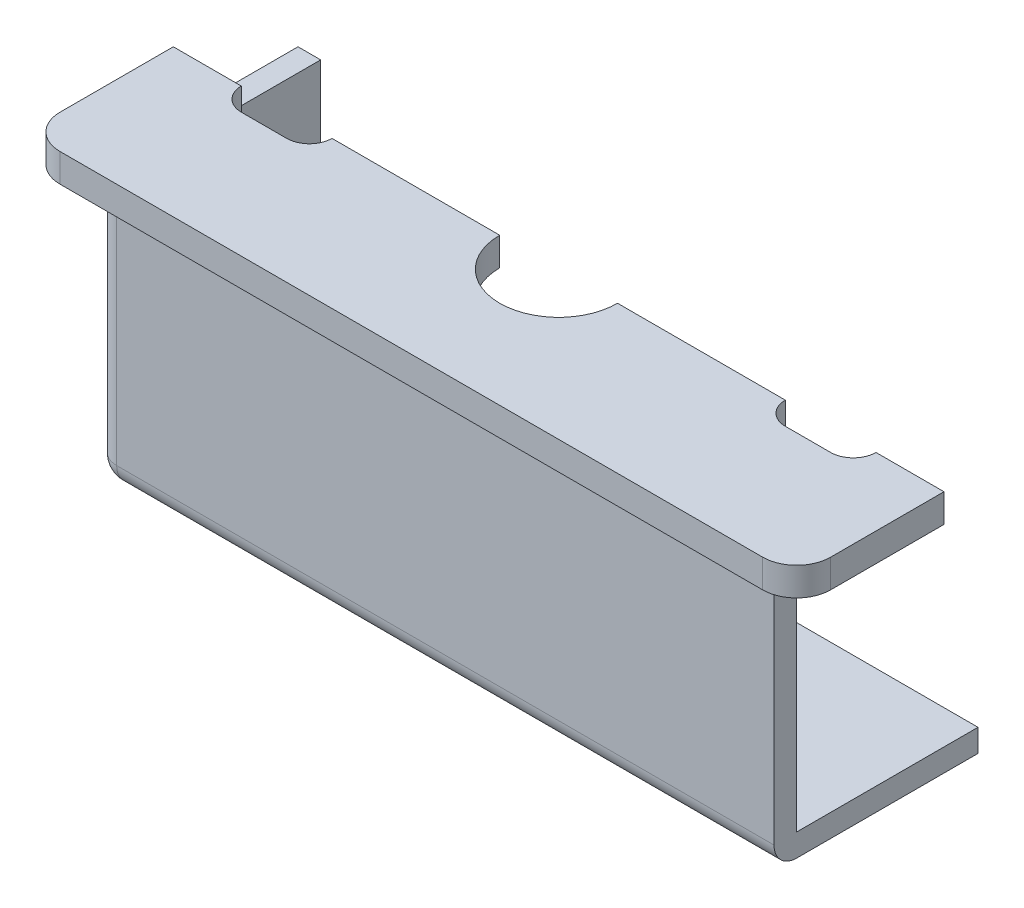
ISO-10303-21;
HEADER;
FILE_DESCRIPTION(('STEP AP214'),'2;1');
FILE_NAME('part.step','',(''),(''),'','','');
FILE_SCHEMA(('AUTOMOTIVE_DESIGN { 1 0 10303 214 1 1 1 1 }'));
ENDSEC;
DATA;
#1=APPLICATION_CONTEXT('core data for automotive mechanical design processes');
#2=APPLICATION_PROTOCOL_DEFINITION('international standard','automotive_design',2000,#1);
#3=PRODUCT_CONTEXT('',#1,'mechanical');
#4=PRODUCT('Part','Part','',(#3));
#5=PRODUCT_RELATED_PRODUCT_CATEGORY('part','',(#4));
#6=PRODUCT_DEFINITION_FORMATION('','',#4);
#7=PRODUCT_DEFINITION_CONTEXT('part definition',#1,'design');
#8=PRODUCT_DEFINITION('design','',#6,#7);
#9=PRODUCT_DEFINITION_SHAPE('','',#8);
#10=(LENGTH_UNIT() NAMED_UNIT(*) SI_UNIT(.MILLI.,.METRE.));
#11=(NAMED_UNIT(*) PLANE_ANGLE_UNIT() SI_UNIT($,.RADIAN.));
#12=(NAMED_UNIT(*) SI_UNIT($,.STERADIAN.) SOLID_ANGLE_UNIT());
#13=UNCERTAINTY_MEASURE_WITH_UNIT(LENGTH_MEASURE(1.E-05),#10,'distance_accuracy_value','');
#14=(GEOMETRIC_REPRESENTATION_CONTEXT(3) GLOBAL_UNCERTAINTY_ASSIGNED_CONTEXT((#13)) GLOBAL_UNIT_ASSIGNED_CONTEXT((#10,
#11,#12)) REPRESENTATION_CONTEXT('',''));
#15=CARTESIAN_POINT('',(0.,0.,0.));
#16=DIRECTION('',(0.,0.,1.));
#17=DIRECTION('',(1.,0.,0.));
#18=AXIS2_PLACEMENT_3D('',#15,#16,#17);
#19=CARTESIAN_POINT('',(14.5,-12.,-3.99999999999999));
#20=DIRECTION('',(1.,0.,0.));
#21=DIRECTION('',(0.,0.,-1.));
#22=AXIS2_PLACEMENT_3D('',#19,#20,#21);
#23=PLANE('',#22);
#24=DIRECTION('',(0.,1.,0.));
#25=VECTOR('',#24,1.);
#26=CARTESIAN_POINT('',(14.5,-12.,5.));
#27=LINE('',#26,#25);
#28=CARTESIAN_POINT('',(14.5,-11.,5.));
#29=VERTEX_POINT('',#28);
#30=CARTESIAN_POINT('',(14.5,0.,5.));
#31=VERTEX_POINT('',#30);
#32=EDGE_CURVE('E286',#29,#31,#27,.T.);
#33=ORIENTED_EDGE('',*,*,#32,.F.);
#34=CARTESIAN_POINT('',(14.5,-11.,4.));
#35=DIRECTION('',(1.,0.,0.));
#36=DIRECTION('',(0.,0.,-1.));
#37=AXIS2_PLACEMENT_3D('',#34,#35,#36);
#38=CIRCLE('',#37,1.);
#39=CARTESIAN_POINT('',(14.5,-12.,4.00000000000001));
#40=VERTEX_POINT('',#39);
#41=EDGE_CURVE('E302',#29,#40,#38,.T.);
#42=ORIENTED_EDGE('',*,*,#41,.T.);
#43=DIRECTION('',(0.,0.,-1.));
#44=VECTOR('',#43,1.);
#45=CARTESIAN_POINT('',(14.5,-12.,-3.99999999999999));
#46=LINE('',#45,#44);
#47=CARTESIAN_POINT('',(14.5,-12.,-3.99999999999999));
#48=VERTEX_POINT('',#47);
#49=EDGE_CURVE('E270',#40,#48,#46,.T.);
#50=ORIENTED_EDGE('',*,*,#49,.T.);
#51=DIRECTION('',(0.,1.,0.));
#52=VECTOR('',#51,1.);
#53=CARTESIAN_POINT('',(14.5,-12.,-3.99999999999999));
#54=LINE('',#53,#52);
#55=CARTESIAN_POINT('',(14.5,-11.,-3.99999999999999));
#56=VERTEX_POINT('',#55);
#57=EDGE_CURVE('E275',#48,#56,#54,.T.);
#58=ORIENTED_EDGE('',*,*,#57,.T.);
#59=DIRECTION('',(0.,0.,1.));
#60=VECTOR('',#59,1.);
#61=CARTESIAN_POINT('',(14.5,-11.,-3.99999999999999));
#62=LINE('',#61,#60);
#63=CARTESIAN_POINT('',(14.5,-11.,4.00000000000001));
#64=VERTEX_POINT('',#63);
#65=EDGE_CURVE('E253',#56,#64,#62,.T.);
#66=ORIENTED_EDGE('',*,*,#65,.T.);
#67=DIRECTION('',(0.,1.,0.));
#68=VECTOR('',#67,1.);
#69=CARTESIAN_POINT('',(14.5,-42.0832179129826,4.00000000000001));
#70=LINE('',#69,#68);
#71=CARTESIAN_POINT('',(14.5,0.,4.00000000000001));
#72=VERTEX_POINT('',#71);
#73=EDGE_CURVE('E251',#64,#72,#70,.T.);
#74=ORIENTED_EDGE('',*,*,#73,.T.);
#75=DIRECTION('',(0.,0.,-1.));
#76=VECTOR('',#75,1.);
#77=CARTESIAN_POINT('',(14.5,0.,-3.99999999999999));
#78=LINE('',#77,#76);
#79=EDGE_CURVE('E269',#31,#72,#78,.T.);
#80=ORIENTED_EDGE('',*,*,#79,.F.);
#81=EDGE_LOOP('',(#33,#42,#50,#58,#66,#74,#80));
#82=FACE_BOUND('',#81,.T.);
#83=ADVANCED_FACE('F38',(#82),#23,.T.);
#84=CARTESIAN_POINT('',(-15.5,-12.,5.));
#85=DIRECTION('',(0.,0.,1.));
#86=DIRECTION('',(1.,0.,0.));
#87=AXIS2_PLACEMENT_3D('',#84,#85,#86);
#88=PLANE('',#87);
#89=DIRECTION('',(1.,0.,0.));
#90=VECTOR('',#89,1.);
#91=CARTESIAN_POINT('',(-15.5,0.,5.));
#92=LINE('',#91,#90);
#93=CARTESIAN_POINT('',(-14.5,0.,5.));
#94=VERTEX_POINT('',#93);
#95=EDGE_CURVE('E273',#94,#31,#92,.T.);
#96=ORIENTED_EDGE('',*,*,#95,.F.);
#97=DIRECTION('',(0.,1.,0.));
#98=VECTOR('',#97,1.);
#99=CARTESIAN_POINT('',(-14.5,-12.,5.));
#100=LINE('',#99,#98);
#101=CARTESIAN_POINT('',(-14.5,-11.,5.));
#102=VERTEX_POINT('',#101);
#103=EDGE_CURVE('E300',#94,#102,#100,.F.);
#104=ORIENTED_EDGE('',*,*,#103,.T.);
#105=DIRECTION('',(1.,0.,0.));
#106=VECTOR('',#105,1.);
#107=CARTESIAN_POINT('',(14.5,-11.,5.));
#108=LINE('',#107,#106);
#109=EDGE_CURVE('E298',#102,#29,#108,.T.);
#110=ORIENTED_EDGE('',*,*,#109,.T.);
#111=ORIENTED_EDGE('',*,*,#32,.T.);
#112=EDGE_LOOP('',(#96,#104,#110,#111));
#113=FACE_BOUND('',#112,.T.);
#114=ADVANCED_FACE('F456',(#113),#88,.T.);
#115=CARTESIAN_POINT('',(-15.5,-12.,-3.99999999999999));
#116=DIRECTION('',(-1.,0.,0.));
#117=DIRECTION('',(0.,0.,1.));
#118=AXIS2_PLACEMENT_3D('',#115,#116,#117);
#119=PLANE('',#118);
#120=DIRECTION('',(0.,0.,1.));
#121=VECTOR('',#120,1.);
#122=CARTESIAN_POINT('',(-15.5,-11.,5.));
#123=LINE('',#122,#121);
#124=CARTESIAN_POINT('',(-15.5,-11.,-3.99999999999999));
#125=VERTEX_POINT('',#124);
#126=CARTESIAN_POINT('',(-15.5,-11.,4.00000000000001));
#127=VERTEX_POINT('',#126);
#128=EDGE_CURVE('E293',#125,#127,#123,.T.);
#129=ORIENTED_EDGE('',*,*,#128,.T.);
#130=DIRECTION('',(0.,1.,0.));
#131=VECTOR('',#130,1.);
#132=CARTESIAN_POINT('',(-15.5,-12.,4.00000000000001));
#133=LINE('',#132,#131);
#134=CARTESIAN_POINT('',(-15.5,0.,4.00000000000001));
#135=VERTEX_POINT('',#134);
#136=EDGE_CURVE('E295',#127,#135,#133,.T.);
#137=ORIENTED_EDGE('',*,*,#136,.T.);
#138=DIRECTION('',(0.,0.,1.));
#139=VECTOR('',#138,1.);
#140=CARTESIAN_POINT('',(-15.5,0.,-3.99999999999999));
#141=LINE('',#140,#139);
#142=CARTESIAN_POINT('',(-15.5,0.,0.));
#143=VERTEX_POINT('',#142);
#144=EDGE_CURVE('E281',#143,#135,#141,.T.);
#145=ORIENTED_EDGE('',*,*,#144,.F.);
#146=CARTESIAN_POINT('',(-15.5,0.,-3.99999999999999));
#147=VERTEX_POINT('',#146);
#148=EDGE_CURVE('E282',#147,#143,#141,.T.);
#149=ORIENTED_EDGE('',*,*,#148,.F.);
#150=DIRECTION('',(0.,1.,0.));
#151=VECTOR('',#150,1.);
#152=CARTESIAN_POINT('',(-15.5,-12.,-3.99999999999999));
#153=LINE('',#152,#151);
#154=EDGE_CURVE('E289',#125,#147,#153,.T.);
#155=ORIENTED_EDGE('',*,*,#154,.F.);
#156=EDGE_LOOP('',(#129,#137,#145,#149,#155));
#157=FACE_BOUND('',#156,.T.);
#158=ADVANCED_FACE('F462',(#157),#119,.T.);
#159=CARTESIAN_POINT('',(-15.5,-12.,-3.99999999999999));
#160=DIRECTION('',(0.,0.,-1.));
#161=DIRECTION('',(-1.,0.,0.));
#162=AXIS2_PLACEMENT_3D('',#159,#160,#161);
#163=PLANE('',#162);
#164=DIRECTION('',(-1.,0.,0.));
#165=VECTOR('',#164,1.);
#166=CARTESIAN_POINT('',(-15.5,-12.,-3.99999999999999));
#167=LINE('',#166,#165);
#168=CARTESIAN_POINT('',(-14.5,-12.,-3.99999999999999));
#169=VERTEX_POINT('',#168);
#170=EDGE_CURVE('E272',#48,#169,#167,.T.);
#171=ORIENTED_EDGE('',*,*,#170,.T.);
#172=CARTESIAN_POINT('',(-14.5,-11.,-3.99999999999999));
#173=DIRECTION('',(0.,0.,-1.));
#174=DIRECTION('',(-1.,0.,0.));
#175=AXIS2_PLACEMENT_3D('',#172,#173,#174);
#176=CIRCLE('',#175,1.);
#177=EDGE_CURVE('E47',#169,#125,#176,.T.);
#178=ORIENTED_EDGE('',*,*,#177,.T.);
#179=ORIENTED_EDGE('',*,*,#154,.T.);
#180=DIRECTION('',(-1.,0.,0.));
#181=VECTOR('',#180,1.);
#182=CARTESIAN_POINT('',(-15.5,0.,-3.99999999999999));
#183=LINE('',#182,#181);
#184=CARTESIAN_POINT('',(-14.5,0.,-3.99999999999999));
#185=VERTEX_POINT('',#184);
#186=EDGE_CURVE('E278',#185,#147,#183,.T.);
#187=ORIENTED_EDGE('',*,*,#186,.F.);
#188=DIRECTION('',(0.,1.,0.));
#189=VECTOR('',#188,1.);
#190=CARTESIAN_POINT('',(-14.5,-42.0832179129826,-3.99999999999999));
#191=LINE('',#190,#189);
#192=CARTESIAN_POINT('',(-14.5,-11.,-3.99999999999999));
#193=VERTEX_POINT('',#192);
#194=EDGE_CURVE('E260',#193,#185,#191,.T.);
#195=ORIENTED_EDGE('',*,*,#194,.F.);
#196=DIRECTION('',(1.,0.,0.));
#197=VECTOR('',#196,1.);
#198=CARTESIAN_POINT('',(14.5,-11.,-3.99999999999999));
#199=LINE('',#198,#197);
#200=EDGE_CURVE('E255',#193,#56,#199,.T.);
#201=ORIENTED_EDGE('',*,*,#200,.T.);
#202=ORIENTED_EDGE('',*,*,#57,.F.);
#203=EDGE_LOOP('',(#171,#178,#179,#187,#195,#201,#202));
#204=FACE_BOUND('',#203,.T.);
#205=ADVANCED_FACE('F468',(#204),#163,.T.);
#206=CARTESIAN_POINT('',(0.,-12.,0.));
#207=DIRECTION('',(0.,1.,0.));
#208=DIRECTION('',(0.,0.,1.));
#209=AXIS2_PLACEMENT_3D('',#206,#207,#208);
#210=PLANE('',#209);
#211=ORIENTED_EDGE('',*,*,#49,.F.);
#212=DIRECTION('',(1.,0.,0.));
#213=VECTOR('',#212,1.);
#214=CARTESIAN_POINT('',(-15.5,-12.,4.));
#215=LINE('',#214,#213);
#216=CARTESIAN_POINT('',(-14.5,-12.,4.));
#217=VERTEX_POINT('',#216);
#218=EDGE_CURVE('E55',#40,#217,#215,.F.);
#219=ORIENTED_EDGE('',*,*,#218,.T.);
#220=DIRECTION('',(0.,0.,1.));
#221=VECTOR('',#220,1.);
#222=CARTESIAN_POINT('',(-14.5,-12.,-3.99999999999999));
#223=LINE('',#222,#221);
#224=EDGE_CURVE('E59',#217,#169,#223,.F.);
#225=ORIENTED_EDGE('',*,*,#224,.T.);
#226=ORIENTED_EDGE('',*,*,#170,.F.);
#227=EDGE_LOOP('',(#211,#219,#225,#226));
#228=FACE_BOUND('',#227,.T.);
#229=ADVANCED_FACE('F507',(#228),#210,.F.);
#230=CARTESIAN_POINT('',(0.,0.,0.));
#231=DIRECTION('',(0.,1.,0.));
#232=DIRECTION('',(0.,0.,1.));
#233=AXIS2_PLACEMENT_3D('',#230,#231,#232);
#234=PLANE('',#233);
#235=DIRECTION('',(-1.,0.,0.));
#236=VECTOR('',#235,1.);
#237=CARTESIAN_POINT('',(-17.,0.,0.));
#238=LINE('',#237,#236);
#239=CARTESIAN_POINT('',(-14.5,0.,0.));
#240=VERTEX_POINT('',#239);
#241=EDGE_CURVE('E288',#240,#143,#238,.T.);
#242=ORIENTED_EDGE('',*,*,#241,.F.);
#243=DIRECTION('',(0.,0.,1.));
#244=VECTOR('',#243,1.);
#245=CARTESIAN_POINT('',(-14.5,0.,-3.99999999999999));
#246=LINE('',#245,#244);
#247=EDGE_CURVE('E242',#185,#240,#246,.T.);
#248=ORIENTED_EDGE('',*,*,#247,.F.);
#249=ORIENTED_EDGE('',*,*,#186,.T.);
#250=ORIENTED_EDGE('',*,*,#148,.T.);
#251=EDGE_LOOP('',(#242,#248,#249,#250));
#252=FACE_BOUND('',#251,.T.);
#253=ADVANCED_FACE('F495',(#252),#234,.T.);
#254=CARTESIAN_POINT('',(14.5,-42.0832179129826,4.00000000000001));
#255=DIRECTION('',(0.,0.,1.));
#256=DIRECTION('',(1.,0.,0.));
#257=AXIS2_PLACEMENT_3D('',#254,#255,#256);
#258=PLANE('',#257);
#259=DIRECTION('',(-1.,0.,0.));
#260=VECTOR('',#259,1.);
#261=CARTESIAN_POINT('',(14.5,-11.,4.00000000000001));
#262=LINE('',#261,#260);
#263=CARTESIAN_POINT('',(-14.5,-11.,4.00000000000001));
#264=VERTEX_POINT('',#263);
#265=EDGE_CURVE('E250',#64,#264,#262,.T.);
#266=ORIENTED_EDGE('',*,*,#265,.T.);
#267=DIRECTION('',(0.,1.,0.));
#268=VECTOR('',#267,1.);
#269=CARTESIAN_POINT('',(-14.5,-42.0832179129826,4.00000000000001));
#270=LINE('',#269,#268);
#271=CARTESIAN_POINT('',(-14.5,0.,4.00000000000001));
#272=VERTEX_POINT('',#271);
#273=EDGE_CURVE('E263',#264,#272,#270,.T.);
#274=ORIENTED_EDGE('',*,*,#273,.T.);
#275=DIRECTION('',(1.,0.,0.));
#276=VECTOR('',#275,1.);
#277=CARTESIAN_POINT('',(14.5,0.,4.00000000000001));
#278=LINE('',#277,#276);
#279=EDGE_CURVE('E258',#272,#72,#278,.T.);
#280=ORIENTED_EDGE('',*,*,#279,.T.);
#281=ORIENTED_EDGE('',*,*,#73,.F.);
#282=EDGE_LOOP('',(#266,#274,#280,#281));
#283=FACE_BOUND('',#282,.T.);
#284=ADVANCED_FACE('F708',(#283),#258,.F.);
#285=CARTESIAN_POINT('',(-14.5,-42.0832179129826,-3.99999999999999));
#286=DIRECTION('',(-1.,0.,0.));
#287=DIRECTION('',(0.,0.,1.));
#288=AXIS2_PLACEMENT_3D('',#285,#286,#287);
#289=PLANE('',#288);
#290=DIRECTION('',(0.,0.,-1.));
#291=VECTOR('',#290,1.);
#292=CARTESIAN_POINT('',(-14.5,-11.,-3.99999999999999));
#293=LINE('',#292,#291);
#294=EDGE_CURVE('E248',#264,#193,#293,.T.);
#295=ORIENTED_EDGE('',*,*,#294,.T.);
#296=ORIENTED_EDGE('',*,*,#194,.T.);
#297=ORIENTED_EDGE('',*,*,#247,.T.);
#298=EDGE_CURVE('E240',#240,#272,#246,.T.);
#299=ORIENTED_EDGE('',*,*,#298,.T.);
#300=ORIENTED_EDGE('',*,*,#273,.F.);
#301=EDGE_LOOP('',(#295,#296,#297,#299,#300));
#302=FACE_BOUND('',#301,.T.);
#303=ADVANCED_FACE('F500',(#302),#289,.F.);
#304=CARTESIAN_POINT('',(0.,-11.,0.));
#305=DIRECTION('',(0.,1.,0.));
#306=DIRECTION('',(0.,0.,1.));
#307=AXIS2_PLACEMENT_3D('',#304,#305,#306);
#308=PLANE('',#307);
#309=ORIENTED_EDGE('',*,*,#65,.F.);
#310=ORIENTED_EDGE('',*,*,#200,.F.);
#311=ORIENTED_EDGE('',*,*,#294,.F.);
#312=ORIENTED_EDGE('',*,*,#265,.F.);
#313=EDGE_LOOP('',(#309,#310,#311,#312));
#314=FACE_BOUND('',#313,.T.);
#315=ADVANCED_FACE('F504',(#314),#308,.T.);
#316=CARTESIAN_POINT('',(0.,1.25,0.));
#317=DIRECTION('',(0.,-1.,0.));
#318=DIRECTION('',(0.,0.,-1.));
#319=AXIS2_PLACEMENT_3D('',#316,#317,#318);
#320=CYLINDRICAL_SURFACE('',#319,2.6);
#321=CARTESIAN_POINT('',(0.,0.,0.));
#322=DIRECTION('',(0.,-1.,0.));
#323=DIRECTION('',(0.,0.,1.));
#324=AXIS2_PLACEMENT_3D('',#321,#322,#323);
#325=CIRCLE('',#324,2.6);
#326=CARTESIAN_POINT('',(2.59999999999999,0.,0.));
#327=VERTEX_POINT('',#326);
#328=CARTESIAN_POINT('',(-2.60000000000001,0.,0.));
#329=VERTEX_POINT('',#328);
#330=EDGE_CURVE('E239',#327,#329,#325,.T.);
#331=ORIENTED_EDGE('',*,*,#330,.T.);
#332=DIRECTION('',(0.,-1.,0.));
#333=VECTOR('',#332,1.);
#334=CARTESIAN_POINT('',(-2.60000000000001,1.25,0.));
#335=LINE('',#334,#333);
#336=CARTESIAN_POINT('',(-2.60000000000001,1.25,0.));
#337=VERTEX_POINT('',#336);
#338=EDGE_CURVE('E219',#337,#329,#335,.T.);
#339=ORIENTED_EDGE('',*,*,#338,.F.);
#340=CARTESIAN_POINT('',(0.,1.25,0.));
#341=DIRECTION('',(0.,-1.,0.));
#342=DIRECTION('',(0.,0.,1.));
#343=AXIS2_PLACEMENT_3D('',#340,#341,#342);
#344=CIRCLE('',#343,2.6);
#345=CARTESIAN_POINT('',(2.59999999999999,1.25,0.));
#346=VERTEX_POINT('',#345);
#347=EDGE_CURVE('E226',#346,#337,#344,.T.);
#348=ORIENTED_EDGE('',*,*,#347,.F.);
#349=DIRECTION('',(0.,-1.,0.));
#350=VECTOR('',#349,1.);
#351=CARTESIAN_POINT('',(2.59999999999999,1.25,0.));
#352=LINE('',#351,#350);
#353=EDGE_CURVE('E351',#346,#327,#352,.T.);
#354=ORIENTED_EDGE('',*,*,#353,.T.);
#355=EDGE_LOOP('',(#331,#339,#348,#354));
#356=FACE_BOUND('',#355,.T.);
#357=ADVANCED_FACE('F237',(#356),#320,.F.);
#358=CARTESIAN_POINT('',(-10.,1.25,0.));
#359=DIRECTION('',(0.,0.,1.));
#360=DIRECTION('',(1.,0.,0.));
#361=AXIS2_PLACEMENT_3D('',#358,#359,#360);
#362=PLANE('',#361);
#363=DIRECTION('',(-1.,0.,0.));
#364=VECTOR('',#363,1.);
#365=CARTESIAN_POINT('',(-10.,0.,0.));
#366=LINE('',#365,#364);
#367=CARTESIAN_POINT('',(-10.,0.,0.));
#368=VERTEX_POINT('',#367);
#369=EDGE_CURVE('E316',#329,#368,#366,.T.);
#370=ORIENTED_EDGE('',*,*,#369,.T.);
#371=DIRECTION('',(0.,-1.,0.));
#372=VECTOR('',#371,1.);
#373=CARTESIAN_POINT('',(-10.,1.25,0.));
#374=LINE('',#373,#372);
#375=CARTESIAN_POINT('',(-10.,1.25,0.));
#376=VERTEX_POINT('',#375);
#377=EDGE_CURVE('E222',#376,#368,#374,.T.);
#378=ORIENTED_EDGE('',*,*,#377,.F.);
#379=DIRECTION('',(-1.,0.,0.));
#380=VECTOR('',#379,1.);
#381=CARTESIAN_POINT('',(-10.,1.25,0.));
#382=LINE('',#381,#380);
#383=EDGE_CURVE('E215',#337,#376,#382,.T.);
#384=ORIENTED_EDGE('',*,*,#383,.F.);
#385=ORIENTED_EDGE('',*,*,#338,.T.);
#386=EDGE_LOOP('',(#370,#378,#384,#385));
#387=FACE_BOUND('',#386,.T.);
#388=ADVANCED_FACE('F217',(#387),#362,.F.);
#389=CARTESIAN_POINT('',(-11.,1.25,0.));
#390=DIRECTION('',(0.,-1.,0.));
#391=DIRECTION('',(0.,0.,-1.));
#392=AXIS2_PLACEMENT_3D('',#389,#390,#391);
#393=CYLINDRICAL_SURFACE('',#392,1.);
#394=CARTESIAN_POINT('',(-11.,0.,0.));
#395=DIRECTION('',(0.,-1.,0.));
#396=DIRECTION('',(0.,0.,1.));
#397=AXIS2_PLACEMENT_3D('',#394,#395,#396);
#398=CIRCLE('',#397,1.);
#399=CARTESIAN_POINT('',(-11.,0.,0.999999999999998));
#400=VERTEX_POINT('',#399);
#401=EDGE_CURVE('E318',#368,#400,#398,.T.);
#402=ORIENTED_EDGE('',*,*,#401,.T.);
#403=DIRECTION('',(0.,-1.,0.));
#404=VECTOR('',#403,1.);
#405=CARTESIAN_POINT('',(-11.,1.25,0.999999999999998));
#406=LINE('',#405,#404);
#407=CARTESIAN_POINT('',(-11.,1.25,0.999999999999998));
#408=VERTEX_POINT('',#407);
#409=EDGE_CURVE('E244',#408,#400,#406,.T.);
#410=ORIENTED_EDGE('',*,*,#409,.F.);
#411=CARTESIAN_POINT('',(-11.,1.25,0.));
#412=DIRECTION('',(0.,-1.,0.));
#413=DIRECTION('',(0.,0.,1.));
#414=AXIS2_PLACEMENT_3D('',#411,#412,#413);
#415=CIRCLE('',#414,1.);
#416=EDGE_CURVE('E225',#376,#408,#415,.T.);
#417=ORIENTED_EDGE('',*,*,#416,.F.);
#418=ORIENTED_EDGE('',*,*,#377,.T.);
#419=EDGE_LOOP('',(#402,#410,#417,#418));
#420=FACE_BOUND('',#419,.T.);
#421=ADVANCED_FACE('F445',(#420),#393,.F.);
#422=CARTESIAN_POINT('',(-13.,1.25,0.999999999999998));
#423=DIRECTION('',(0.,0.,1.));
#424=DIRECTION('',(1.,0.,0.));
#425=AXIS2_PLACEMENT_3D('',#422,#423,#424);
#426=PLANE('',#425);
#427=DIRECTION('',(-1.,0.,0.));
#428=VECTOR('',#427,1.);
#429=CARTESIAN_POINT('',(-13.,0.,0.999999999999998));
#430=LINE('',#429,#428);
#431=CARTESIAN_POINT('',(-13.,0.,0.999999999999999));
#432=VERTEX_POINT('',#431);
#433=EDGE_CURVE('E324',#400,#432,#430,.T.);
#434=ORIENTED_EDGE('',*,*,#433,.T.);
#435=DIRECTION('',(0.,-1.,0.));
#436=VECTOR('',#435,1.);
#437=CARTESIAN_POINT('',(-13.,1.25,0.999999999999999));
#438=LINE('',#437,#436);
#439=CARTESIAN_POINT('',(-13.,1.25,0.999999999999999));
#440=VERTEX_POINT('',#439);
#441=EDGE_CURVE('E386',#440,#432,#438,.T.);
#442=ORIENTED_EDGE('',*,*,#441,.F.);
#443=DIRECTION('',(-1.,0.,0.));
#444=VECTOR('',#443,1.);
#445=CARTESIAN_POINT('',(-13.,1.25,0.999999999999998));
#446=LINE('',#445,#444);
#447=EDGE_CURVE('E395',#408,#440,#446,.T.);
#448=ORIENTED_EDGE('',*,*,#447,.F.);
#449=ORIENTED_EDGE('',*,*,#409,.T.);
#450=EDGE_LOOP('',(#434,#442,#448,#449));
#451=FACE_BOUND('',#450,.T.);
#452=ADVANCED_FACE('F393',(#451),#426,.F.);
#453=CARTESIAN_POINT('',(-13.,1.25,0.));
#454=DIRECTION('',(0.,-1.,0.));
#455=DIRECTION('',(0.,0.,-1.));
#456=AXIS2_PLACEMENT_3D('',#453,#454,#455);
#457=CYLINDRICAL_SURFACE('',#456,1.);
#458=CARTESIAN_POINT('',(-13.,0.,0.));
#459=DIRECTION('',(0.,-1.,0.));
#460=DIRECTION('',(0.,0.,1.));
#461=AXIS2_PLACEMENT_3D('',#458,#459,#460);
#462=CIRCLE('',#461,1.);
#463=CARTESIAN_POINT('',(-14.,0.,0.));
#464=VERTEX_POINT('',#463);
#465=EDGE_CURVE('E326',#432,#464,#462,.T.);
#466=ORIENTED_EDGE('',*,*,#465,.T.);
#467=DIRECTION('',(0.,-1.,0.));
#468=VECTOR('',#467,1.);
#469=CARTESIAN_POINT('',(-14.,1.25,0.));
#470=LINE('',#469,#468);
#471=CARTESIAN_POINT('',(-14.,1.25,0.));
#472=VERTEX_POINT('',#471);
#473=EDGE_CURVE('E383',#472,#464,#470,.T.);
#474=ORIENTED_EDGE('',*,*,#473,.F.);
#475=CARTESIAN_POINT('',(-13.,1.25,0.));
#476=DIRECTION('',(0.,-1.,0.));
#477=DIRECTION('',(0.,0.,1.));
#478=AXIS2_PLACEMENT_3D('',#475,#476,#477);
#479=CIRCLE('',#478,1.);
#480=EDGE_CURVE('E415',#440,#472,#479,.T.);
#481=ORIENTED_EDGE('',*,*,#480,.F.);
#482=ORIENTED_EDGE('',*,*,#441,.T.);
#483=EDGE_LOOP('',(#466,#474,#481,#482));
#484=FACE_BOUND('',#483,.T.);
#485=ADVANCED_FACE('F405',(#484),#457,.F.);
#486=CARTESIAN_POINT('',(-17.,1.25,0.));
#487=DIRECTION('',(0.,0.,1.));
#488=DIRECTION('',(1.,0.,0.));
#489=AXIS2_PLACEMENT_3D('',#486,#487,#488);
#490=PLANE('',#489);
#491=EDGE_CURVE('E329',#464,#240,#238,.T.);
#492=ORIENTED_EDGE('',*,*,#491,.T.);
#493=ORIENTED_EDGE('',*,*,#241,.T.);
#494=CARTESIAN_POINT('',(-17.,0.,0.));
#495=VERTEX_POINT('',#494);
#496=EDGE_CURVE('E328',#143,#495,#238,.T.);
#497=ORIENTED_EDGE('',*,*,#496,.T.);
#498=DIRECTION('',(0.,-1.,0.));
#499=VECTOR('',#498,1.);
#500=CARTESIAN_POINT('',(-17.,1.25,0.));
#501=LINE('',#500,#499);
#502=CARTESIAN_POINT('',(-17.,1.25,0.));
#503=VERTEX_POINT('',#502);
#504=EDGE_CURVE('E380',#503,#495,#501,.T.);
#505=ORIENTED_EDGE('',*,*,#504,.F.);
#506=DIRECTION('',(-1.,0.,0.));
#507=VECTOR('',#506,1.);
#508=CARTESIAN_POINT('',(-17.,1.25,0.));
#509=LINE('',#508,#507);
#510=EDGE_CURVE('E412',#472,#503,#509,.T.);
#511=ORIENTED_EDGE('',*,*,#510,.F.);
#512=ORIENTED_EDGE('',*,*,#473,.T.);
#513=EDGE_LOOP('',(#492,#493,#497,#505,#511,#512));
#514=FACE_BOUND('',#513,.T.);
#515=ADVANCED_FACE('F409',(#514),#490,.F.);
#516=CARTESIAN_POINT('',(-17.,1.25,0.));
#517=DIRECTION('',(1.,0.,0.));
#518=DIRECTION('',(0.,0.,-1.));
#519=AXIS2_PLACEMENT_3D('',#516,#517,#518);
#520=PLANE('',#519);
#521=DIRECTION('',(0.,0.,1.));
#522=VECTOR('',#521,1.);
#523=CARTESIAN_POINT('',(-17.,0.,0.));
#524=LINE('',#523,#522);
#525=CARTESIAN_POINT('',(-17.,0.,4.99999999999999));
#526=VERTEX_POINT('',#525);
#527=EDGE_CURVE('E332',#495,#526,#524,.T.);
#528=ORIENTED_EDGE('',*,*,#527,.T.);
#529=DIRECTION('',(0.,-1.,0.));
#530=VECTOR('',#529,1.);
#531=CARTESIAN_POINT('',(-17.,1.25,4.99999999999999));
#532=LINE('',#531,#530);
#533=CARTESIAN_POINT('',(-17.,1.25,4.99999999999999));
#534=VERTEX_POINT('',#533);
#535=EDGE_CURVE('E377',#534,#526,#532,.T.);
#536=ORIENTED_EDGE('',*,*,#535,.F.);
#537=DIRECTION('',(0.,0.,1.));
#538=VECTOR('',#537,1.);
#539=CARTESIAN_POINT('',(-17.,1.25,0.));
#540=LINE('',#539,#538);
#541=EDGE_CURVE('E414',#503,#534,#540,.T.);
#542=ORIENTED_EDGE('',*,*,#541,.F.);
#543=ORIENTED_EDGE('',*,*,#504,.T.);
#544=EDGE_LOOP('',(#528,#536,#542,#543));
#545=FACE_BOUND('',#544,.T.);
#546=ADVANCED_FACE('F517',(#545),#520,.F.);
#547=CARTESIAN_POINT('',(-15.5,1.25,5.));
#548=DIRECTION('',(0.,-1.,0.));
#549=DIRECTION('',(0.,0.,-1.));
#550=AXIS2_PLACEMENT_3D('',#547,#548,#549);
#551=CYLINDRICAL_SURFACE('',#550,1.5);
#552=CARTESIAN_POINT('',(-15.5,0.,5.));
#553=DIRECTION('',(0.,1.,0.));
#554=DIRECTION('',(0.,0.,1.));
#555=AXIS2_PLACEMENT_3D('',#552,#553,#554);
#556=CIRCLE('',#555,1.5);
#557=CARTESIAN_POINT('',(-15.5,0.,6.5));
#558=VERTEX_POINT('',#557);
#559=EDGE_CURVE('E334',#526,#558,#556,.T.);
#560=ORIENTED_EDGE('',*,*,#559,.T.);
#561=DIRECTION('',(0.,-1.,0.));
#562=VECTOR('',#561,1.);
#563=CARTESIAN_POINT('',(-15.5,1.25,6.5));
#564=LINE('',#563,#562);
#565=CARTESIAN_POINT('',(-15.5,1.25,6.5));
#566=VERTEX_POINT('',#565);
#567=EDGE_CURVE('E374',#566,#558,#564,.T.);
#568=ORIENTED_EDGE('',*,*,#567,.F.);
#569=CARTESIAN_POINT('',(-15.5,1.25,5.));
#570=DIRECTION('',(0.,1.,0.));
#571=DIRECTION('',(0.,0.,1.));
#572=AXIS2_PLACEMENT_3D('',#569,#570,#571);
#573=CIRCLE('',#572,1.5);
#574=EDGE_CURVE('E417',#534,#566,#573,.T.);
#575=ORIENTED_EDGE('',*,*,#574,.F.);
#576=ORIENTED_EDGE('',*,*,#535,.T.);
#577=EDGE_LOOP('',(#560,#568,#575,#576));
#578=FACE_BOUND('',#577,.T.);
#579=ADVANCED_FACE('F524',(#578),#551,.T.);
#580=CARTESIAN_POINT('',(-15.5,1.25,6.5));
#581=DIRECTION('',(0.,0.,-1.));
#582=DIRECTION('',(-1.,0.,0.));
#583=AXIS2_PLACEMENT_3D('',#580,#581,#582);
#584=PLANE('',#583);
#585=DIRECTION('',(1.,0.,0.));
#586=VECTOR('',#585,1.);
#587=CARTESIAN_POINT('',(-15.5,0.,6.5));
#588=LINE('',#587,#586);
#589=CARTESIAN_POINT('',(15.5,0.,6.5));
#590=VERTEX_POINT('',#589);
#591=EDGE_CURVE('E336',#558,#590,#588,.T.);
#592=ORIENTED_EDGE('',*,*,#591,.T.);
#593=DIRECTION('',(0.,-1.,0.));
#594=VECTOR('',#593,1.);
#595=CARTESIAN_POINT('',(15.5,1.25,6.5));
#596=LINE('',#595,#594);
#597=CARTESIAN_POINT('',(15.5,1.25,6.5));
#598=VERTEX_POINT('',#597);
#599=EDGE_CURVE('E371',#598,#590,#596,.T.);
#600=ORIENTED_EDGE('',*,*,#599,.F.);
#601=DIRECTION('',(1.,0.,0.));
#602=VECTOR('',#601,1.);
#603=CARTESIAN_POINT('',(-15.5,1.25,6.5));
#604=LINE('',#603,#602);
#605=EDGE_CURVE('E423',#566,#598,#604,.T.);
#606=ORIENTED_EDGE('',*,*,#605,.F.);
#607=ORIENTED_EDGE('',*,*,#567,.T.);
#608=EDGE_LOOP('',(#592,#600,#606,#607));
#609=FACE_BOUND('',#608,.T.);
#610=ADVANCED_FACE('F527',(#609),#584,.F.);
#611=CARTESIAN_POINT('',(15.5,1.25,5.));
#612=DIRECTION('',(0.,-1.,0.));
#613=DIRECTION('',(0.,0.,-1.));
#614=AXIS2_PLACEMENT_3D('',#611,#612,#613);
#615=CYLINDRICAL_SURFACE('',#614,1.5);
#616=CARTESIAN_POINT('',(15.5,0.,5.));
#617=DIRECTION('',(0.,1.,0.));
#618=DIRECTION('',(0.,0.,1.));
#619=AXIS2_PLACEMENT_3D('',#616,#617,#618);
#620=CIRCLE('',#619,1.5);
#621=CARTESIAN_POINT('',(17.,0.,4.99999999999999));
#622=VERTEX_POINT('',#621);
#623=EDGE_CURVE('E338',#590,#622,#620,.T.);
#624=ORIENTED_EDGE('',*,*,#623,.T.);
#625=DIRECTION('',(0.,-1.,0.));
#626=VECTOR('',#625,1.);
#627=CARTESIAN_POINT('',(17.,1.25,4.99999999999999));
#628=LINE('',#627,#626);
#629=CARTESIAN_POINT('',(17.,1.25,4.99999999999999));
#630=VERTEX_POINT('',#629);
#631=EDGE_CURVE('E368',#630,#622,#628,.T.);
#632=ORIENTED_EDGE('',*,*,#631,.F.);
#633=CARTESIAN_POINT('',(15.5,1.25,5.));
#634=DIRECTION('',(0.,1.,0.));
#635=DIRECTION('',(0.,0.,1.));
#636=AXIS2_PLACEMENT_3D('',#633,#634,#635);
#637=CIRCLE('',#636,1.5);
#638=EDGE_CURVE('E425',#598,#630,#637,.T.);
#639=ORIENTED_EDGE('',*,*,#638,.F.);
#640=ORIENTED_EDGE('',*,*,#599,.T.);
#641=EDGE_LOOP('',(#624,#632,#639,#640));
#642=FACE_BOUND('',#641,.T.);
#643=ADVANCED_FACE('F532',(#642),#615,.T.);
#644=CARTESIAN_POINT('',(17.,1.25,0.));
#645=DIRECTION('',(-1.,0.,0.));
#646=DIRECTION('',(0.,0.,1.));
#647=AXIS2_PLACEMENT_3D('',#644,#645,#646);
#648=PLANE('',#647);
#649=DIRECTION('',(0.,0.,-1.));
#650=VECTOR('',#649,1.);
#651=CARTESIAN_POINT('',(17.,0.,0.));
#652=LINE('',#651,#650);
#653=CARTESIAN_POINT('',(17.,0.,0.));
#654=VERTEX_POINT('',#653);
#655=EDGE_CURVE('E340',#622,#654,#652,.T.);
#656=ORIENTED_EDGE('',*,*,#655,.T.);
#657=DIRECTION('',(0.,-1.,0.));
#658=VECTOR('',#657,1.);
#659=CARTESIAN_POINT('',(17.,1.25,0.));
#660=LINE('',#659,#658);
#661=CARTESIAN_POINT('',(17.,1.25,0.));
#662=VERTEX_POINT('',#661);
#663=EDGE_CURVE('E365',#662,#654,#660,.T.);
#664=ORIENTED_EDGE('',*,*,#663,.F.);
#665=DIRECTION('',(0.,0.,-1.));
#666=VECTOR('',#665,1.);
#667=CARTESIAN_POINT('',(17.,1.25,0.));
#668=LINE('',#667,#666);
#669=EDGE_CURVE('E427',#630,#662,#668,.T.);
#670=ORIENTED_EDGE('',*,*,#669,.F.);
#671=ORIENTED_EDGE('',*,*,#631,.T.);
#672=EDGE_LOOP('',(#656,#664,#670,#671));
#673=FACE_BOUND('',#672,.T.);
#674=ADVANCED_FACE('F538',(#673),#648,.F.);
#675=CARTESIAN_POINT('',(14.,1.25,0.));
#676=DIRECTION('',(0.,0.,1.));
#677=DIRECTION('',(1.,0.,0.));
#678=AXIS2_PLACEMENT_3D('',#675,#676,#677);
#679=PLANE('',#678);
#680=DIRECTION('',(-1.,0.,0.));
#681=VECTOR('',#680,1.);
#682=CARTESIAN_POINT('',(14.,0.,0.));
#683=LINE('',#682,#681);
#684=CARTESIAN_POINT('',(14.,0.,0.));
#685=VERTEX_POINT('',#684);
#686=EDGE_CURVE('E342',#654,#685,#683,.T.);
#687=ORIENTED_EDGE('',*,*,#686,.T.);
#688=DIRECTION('',(0.,-1.,0.));
#689=VECTOR('',#688,1.);
#690=CARTESIAN_POINT('',(14.,1.25,0.));
#691=LINE('',#690,#689);
#692=CARTESIAN_POINT('',(14.,1.25,0.));
#693=VERTEX_POINT('',#692);
#694=EDGE_CURVE('E362',#693,#685,#691,.T.);
#695=ORIENTED_EDGE('',*,*,#694,.F.);
#696=DIRECTION('',(-1.,0.,0.));
#697=VECTOR('',#696,1.);
#698=CARTESIAN_POINT('',(14.,1.25,0.));
#699=LINE('',#698,#697);
#700=EDGE_CURVE('E429',#662,#693,#699,.T.);
#701=ORIENTED_EDGE('',*,*,#700,.F.);
#702=ORIENTED_EDGE('',*,*,#663,.T.);
#703=EDGE_LOOP('',(#687,#695,#701,#702));
#704=FACE_BOUND('',#703,.T.);
#705=ADVANCED_FACE('F542',(#704),#679,.F.);
#706=CARTESIAN_POINT('',(13.,1.25,0.));
#707=DIRECTION('',(0.,-1.,0.));
#708=DIRECTION('',(0.,0.,-1.));
#709=AXIS2_PLACEMENT_3D('',#706,#707,#708);
#710=CYLINDRICAL_SURFACE('',#709,1.);
#711=CARTESIAN_POINT('',(13.,0.,0.));
#712=DIRECTION('',(0.,-1.,0.));
#713=DIRECTION('',(0.,0.,1.));
#714=AXIS2_PLACEMENT_3D('',#711,#712,#713);
#715=CIRCLE('',#714,1.);
#716=CARTESIAN_POINT('',(13.,0.,1.));
#717=VERTEX_POINT('',#716);
#718=EDGE_CURVE('E344',#685,#717,#715,.T.);
#719=ORIENTED_EDGE('',*,*,#718,.T.);
#720=DIRECTION('',(0.,-1.,0.));
#721=VECTOR('',#720,1.);
#722=CARTESIAN_POINT('',(13.,1.25,1.));
#723=LINE('',#722,#721);
#724=CARTESIAN_POINT('',(13.,1.25,1.));
#725=VERTEX_POINT('',#724);
#726=EDGE_CURVE('E359',#725,#717,#723,.T.);
#727=ORIENTED_EDGE('',*,*,#726,.F.);
#728=CARTESIAN_POINT('',(13.,1.25,0.));
#729=DIRECTION('',(0.,-1.,0.));
#730=DIRECTION('',(0.,0.,1.));
#731=AXIS2_PLACEMENT_3D('',#728,#729,#730);
#732=CIRCLE('',#731,1.);
#733=EDGE_CURVE('E431',#693,#725,#732,.T.);
#734=ORIENTED_EDGE('',*,*,#733,.F.);
#735=ORIENTED_EDGE('',*,*,#694,.T.);
#736=EDGE_LOOP('',(#719,#727,#734,#735));
#737=FACE_BOUND('',#736,.T.);
#738=ADVANCED_FACE('F547',(#737),#710,.F.);
#739=CARTESIAN_POINT('',(11.,1.25,1.));
#740=DIRECTION('',(0.,0.,1.));
#741=DIRECTION('',(1.,0.,0.));
#742=AXIS2_PLACEMENT_3D('',#739,#740,#741);
#743=PLANE('',#742);
#744=DIRECTION('',(-1.,0.,0.));
#745=VECTOR('',#744,1.);
#746=CARTESIAN_POINT('',(11.,0.,1.));
#747=LINE('',#746,#745);
#748=CARTESIAN_POINT('',(11.,0.,1.));
#749=VERTEX_POINT('',#748);
#750=EDGE_CURVE('E346',#717,#749,#747,.T.);
#751=ORIENTED_EDGE('',*,*,#750,.T.);
#752=DIRECTION('',(0.,-1.,0.));
#753=VECTOR('',#752,1.);
#754=CARTESIAN_POINT('',(11.,1.25,1.));
#755=LINE('',#754,#753);
#756=CARTESIAN_POINT('',(11.,1.25,1.));
#757=VERTEX_POINT('',#756);
#758=EDGE_CURVE('E356',#757,#749,#755,.T.);
#759=ORIENTED_EDGE('',*,*,#758,.F.);
#760=DIRECTION('',(-1.,0.,0.));
#761=VECTOR('',#760,1.);
#762=CARTESIAN_POINT('',(11.,1.25,1.));
#763=LINE('',#762,#761);
#764=EDGE_CURVE('E433',#725,#757,#763,.T.);
#765=ORIENTED_EDGE('',*,*,#764,.F.);
#766=ORIENTED_EDGE('',*,*,#726,.T.);
#767=EDGE_LOOP('',(#751,#759,#765,#766));
#768=FACE_BOUND('',#767,.T.);
#769=ADVANCED_FACE('F550',(#768),#743,.F.);
#770=CARTESIAN_POINT('',(11.,1.25,0.));
#771=DIRECTION('',(0.,-1.,0.));
#772=DIRECTION('',(0.,0.,-1.));
#773=AXIS2_PLACEMENT_3D('',#770,#771,#772);
#774=CYLINDRICAL_SURFACE('',#773,1.);
#775=CARTESIAN_POINT('',(11.,0.,0.));
#776=DIRECTION('',(0.,-1.,0.));
#777=DIRECTION('',(0.,0.,1.));
#778=AXIS2_PLACEMENT_3D('',#775,#776,#777);
#779=CIRCLE('',#778,1.);
#780=CARTESIAN_POINT('',(9.99999999999999,0.,0.));
#781=VERTEX_POINT('',#780);
#782=EDGE_CURVE('E348',#749,#781,#779,.T.);
#783=ORIENTED_EDGE('',*,*,#782,.T.);
#784=DIRECTION('',(0.,-1.,0.));
#785=VECTOR('',#784,1.);
#786=CARTESIAN_POINT('',(9.99999999999999,1.25,0.));
#787=LINE('',#786,#785);
#788=CARTESIAN_POINT('',(9.99999999999999,1.25,0.));
#789=VERTEX_POINT('',#788);
#790=EDGE_CURVE('E353',#789,#781,#787,.T.);
#791=ORIENTED_EDGE('',*,*,#790,.F.);
#792=CARTESIAN_POINT('',(11.,1.25,0.));
#793=DIRECTION('',(0.,-1.,0.));
#794=DIRECTION('',(0.,0.,1.));
#795=AXIS2_PLACEMENT_3D('',#792,#793,#794);
#796=CIRCLE('',#795,1.);
#797=EDGE_CURVE('E434',#757,#789,#796,.T.);
#798=ORIENTED_EDGE('',*,*,#797,.F.);
#799=ORIENTED_EDGE('',*,*,#758,.T.);
#800=EDGE_LOOP('',(#783,#791,#798,#799));
#801=FACE_BOUND('',#800,.T.);
#802=ADVANCED_FACE('F440',(#801),#774,.F.);
#803=CARTESIAN_POINT('',(2.59999999999999,1.25,0.));
#804=DIRECTION('',(0.,0.,1.));
#805=DIRECTION('',(1.,0.,0.));
#806=AXIS2_PLACEMENT_3D('',#803,#804,#805);
#807=PLANE('',#806);
#808=DIRECTION('',(-1.,0.,0.));
#809=VECTOR('',#808,1.);
#810=CARTESIAN_POINT('',(2.59999999999999,0.,0.));
#811=LINE('',#810,#809);
#812=EDGE_CURVE('E235',#781,#327,#811,.T.);
#813=ORIENTED_EDGE('',*,*,#812,.T.);
#814=ORIENTED_EDGE('',*,*,#353,.F.);
#815=DIRECTION('',(-1.,0.,0.));
#816=VECTOR('',#815,1.);
#817=CARTESIAN_POINT('',(2.59999999999999,1.25,0.));
#818=LINE('',#817,#816);
#819=EDGE_CURVE('E231',#789,#346,#818,.T.);
#820=ORIENTED_EDGE('',*,*,#819,.F.);
#821=ORIENTED_EDGE('',*,*,#790,.T.);
#822=EDGE_LOOP('',(#813,#814,#820,#821));
#823=FACE_BOUND('',#822,.T.);
#824=ADVANCED_FACE('F444',(#823),#807,.F.);
#825=CARTESIAN_POINT('',(0.,1.25,0.));
#826=DIRECTION('',(0.,1.,0.));
#827=DIRECTION('',(0.,0.,1.));
#828=AXIS2_PLACEMENT_3D('',#825,#826,#827);
#829=PLANE('',#828);
#830=ORIENTED_EDGE('',*,*,#347,.T.);
#831=ORIENTED_EDGE('',*,*,#383,.T.);
#832=ORIENTED_EDGE('',*,*,#416,.T.);
#833=ORIENTED_EDGE('',*,*,#447,.T.);
#834=ORIENTED_EDGE('',*,*,#480,.T.);
#835=ORIENTED_EDGE('',*,*,#510,.T.);
#836=ORIENTED_EDGE('',*,*,#541,.T.);
#837=ORIENTED_EDGE('',*,*,#574,.T.);
#838=ORIENTED_EDGE('',*,*,#605,.T.);
#839=ORIENTED_EDGE('',*,*,#638,.T.);
#840=ORIENTED_EDGE('',*,*,#669,.T.);
#841=ORIENTED_EDGE('',*,*,#700,.T.);
#842=ORIENTED_EDGE('',*,*,#733,.T.);
#843=ORIENTED_EDGE('',*,*,#764,.T.);
#844=ORIENTED_EDGE('',*,*,#797,.T.);
#845=ORIENTED_EDGE('',*,*,#819,.T.);
#846=EDGE_LOOP('',(#830,#831,#832,#833,#834,#835,#836,#837,#838,#839,#840,#841,#842,#843,#844,#845));
#847=FACE_BOUND('',#846,.T.);
#848=ADVANCED_FACE('F229',(#847),#829,.T.);
#849=CARTESIAN_POINT('',(0.,0.,0.));
#850=DIRECTION('',(0.,1.,0.));
#851=DIRECTION('',(0.,0.,1.));
#852=AXIS2_PLACEMENT_3D('',#849,#850,#851);
#853=PLANE('',#852);
#854=ORIENTED_EDGE('',*,*,#298,.F.);
#855=ORIENTED_EDGE('',*,*,#491,.F.);
#856=ORIENTED_EDGE('',*,*,#465,.F.);
#857=ORIENTED_EDGE('',*,*,#433,.F.);
#858=ORIENTED_EDGE('',*,*,#401,.F.);
#859=ORIENTED_EDGE('',*,*,#369,.F.);
#860=ORIENTED_EDGE('',*,*,#330,.F.);
#861=ORIENTED_EDGE('',*,*,#812,.F.);
#862=ORIENTED_EDGE('',*,*,#782,.F.);
#863=ORIENTED_EDGE('',*,*,#750,.F.);
#864=ORIENTED_EDGE('',*,*,#718,.F.);
#865=ORIENTED_EDGE('',*,*,#686,.F.);
#866=ORIENTED_EDGE('',*,*,#655,.F.);
#867=ORIENTED_EDGE('',*,*,#623,.F.);
#868=ORIENTED_EDGE('',*,*,#591,.F.);
#869=ORIENTED_EDGE('',*,*,#559,.F.);
#870=ORIENTED_EDGE('',*,*,#527,.F.);
#871=ORIENTED_EDGE('',*,*,#496,.F.);
#872=ORIENTED_EDGE('',*,*,#144,.T.);
#873=CARTESIAN_POINT('',(-14.5,0.,4.00000000000001));
#874=DIRECTION('',(0.,1.,0.));
#875=DIRECTION('',(0.,0.,1.));
#876=AXIS2_PLACEMENT_3D('',#873,#874,#875);
#877=CIRCLE('',#876,1.);
#878=EDGE_CURVE('E12',#135,#94,#877,.T.);
#879=ORIENTED_EDGE('',*,*,#878,.T.);
#880=ORIENTED_EDGE('',*,*,#95,.T.);
#881=ORIENTED_EDGE('',*,*,#79,.T.);
#882=ORIENTED_EDGE('',*,*,#279,.F.);
#883=EDGE_LOOP('',(#854,#855,#856,#857,#858,#859,#860,#861,#862,#863,#864,#865,#866,#867,#868,
#869,#870,#871,#872,#879,#880,#881,#882));
#884=FACE_BOUND('',#883,.T.);
#885=ADVANCED_FACE('F401',(#884),#853,.F.);
#886=CARTESIAN_POINT('',(-15.5,-11.,4.));
#887=DIRECTION('',(-1.,0.,0.));
#888=DIRECTION('',(0.,0.,1.));
#889=AXIS2_PLACEMENT_3D('',#886,#887,#888);
#890=CYLINDRICAL_SURFACE('',#889,1.);
#891=ORIENTED_EDGE('',*,*,#41,.F.);
#892=ORIENTED_EDGE('',*,*,#109,.F.);
#893=CARTESIAN_POINT('',(-14.5,-11.,4.));
#894=DIRECTION('',(-1.,0.,0.));
#895=DIRECTION('',(0.,0.,1.));
#896=AXIS2_PLACEMENT_3D('',#893,#894,#895);
#897=CIRCLE('',#896,1.);
#898=EDGE_CURVE('E42',#217,#102,#897,.T.);
#899=ORIENTED_EDGE('',*,*,#898,.F.);
#900=ORIENTED_EDGE('',*,*,#218,.F.);
#901=EDGE_LOOP('',(#891,#892,#899,#900));
#902=FACE_BOUND('',#901,.T.);
#903=ADVANCED_FACE('F40',(#902),#890,.T.);
#904=CARTESIAN_POINT('',(-14.5,-11.,-3.99999999999999));
#905=DIRECTION('',(0.,0.,-1.));
#906=DIRECTION('',(-1.,0.,0.));
#907=AXIS2_PLACEMENT_3D('',#904,#905,#906);
#908=CYLINDRICAL_SURFACE('',#907,1.);
#909=ORIENTED_EDGE('',*,*,#177,.F.);
#910=ORIENTED_EDGE('',*,*,#224,.F.);
#911=CARTESIAN_POINT('',(-14.5,-11.,4.00000000000001));
#912=DIRECTION('',(0.,0.,1.));
#913=DIRECTION('',(0.,-1.,0.));
#914=AXIS2_PLACEMENT_3D('',#911,#912,#913);
#915=CIRCLE('',#914,1.);
#916=EDGE_CURVE('E309',#127,#217,#915,.T.);
#917=ORIENTED_EDGE('',*,*,#916,.F.);
#918=ORIENTED_EDGE('',*,*,#128,.F.);
#919=EDGE_LOOP('',(#909,#910,#917,#918));
#920=FACE_BOUND('',#919,.T.);
#921=ADVANCED_FACE('F476',(#920),#908,.T.);
#922=CARTESIAN_POINT('',(-14.5,-11.,4.));
#923=DIRECTION('',(0.,-1.,0.));
#924=DIRECTION('',(0.,0.,-1.));
#925=AXIS2_PLACEMENT_3D('',#922,#923,#924);
#926=SPHERICAL_SURFACE('',#925,1.);
#927=ORIENTED_EDGE('',*,*,#916,.T.);
#928=ORIENTED_EDGE('',*,*,#898,.T.);
#929=CARTESIAN_POINT('',(-14.5,-11.,4.));
#930=DIRECTION('',(0.,-1.,0.));
#931=DIRECTION('',(0.,0.,-1.));
#932=AXIS2_PLACEMENT_3D('',#929,#930,#931);
#933=CIRCLE('',#932,1.);
#934=EDGE_CURVE('E307',#127,#102,#933,.F.);
#935=ORIENTED_EDGE('',*,*,#934,.F.);
#936=EDGE_LOOP('',(#927,#928,#935));
#937=FACE_BOUND('',#936,.T.);
#938=ADVANCED_FACE('F473',(#937),#926,.T.);
#939=CARTESIAN_POINT('',(-14.5,-12.,4.00000000000001));
#940=DIRECTION('',(0.,1.,0.));
#941=DIRECTION('',(0.,0.,1.));
#942=AXIS2_PLACEMENT_3D('',#939,#940,#941);
#943=CYLINDRICAL_SURFACE('',#942,1.);
#944=ORIENTED_EDGE('',*,*,#934,.T.);
#945=ORIENTED_EDGE('',*,*,#103,.F.);
#946=ORIENTED_EDGE('',*,*,#878,.F.);
#947=ORIENTED_EDGE('',*,*,#136,.F.);
#948=EDGE_LOOP('',(#944,#945,#946,#947));
#949=FACE_BOUND('',#948,.T.);
#950=ADVANCED_FACE('F470',(#949),#943,.T.);
#951=CLOSED_SHELL('',(#83,#114,#158,#205,#229,#253,#284,#303,#315,#357,#388,#421,#452,#485,#515,
#546,#579,#610,#643,#674,#705,#738,#769,#802,#824,#848,#885,#903,#921,#938,#950));
#952=MANIFOLD_SOLID_BREP('B2',#951);
#953=ADVANCED_BREP_SHAPE_REPRESENTATION('',(#18,#952),#14);
#954=SHAPE_DEFINITION_REPRESENTATION(#9,#953);
ENDSEC;
END-ISO-10303-21;
